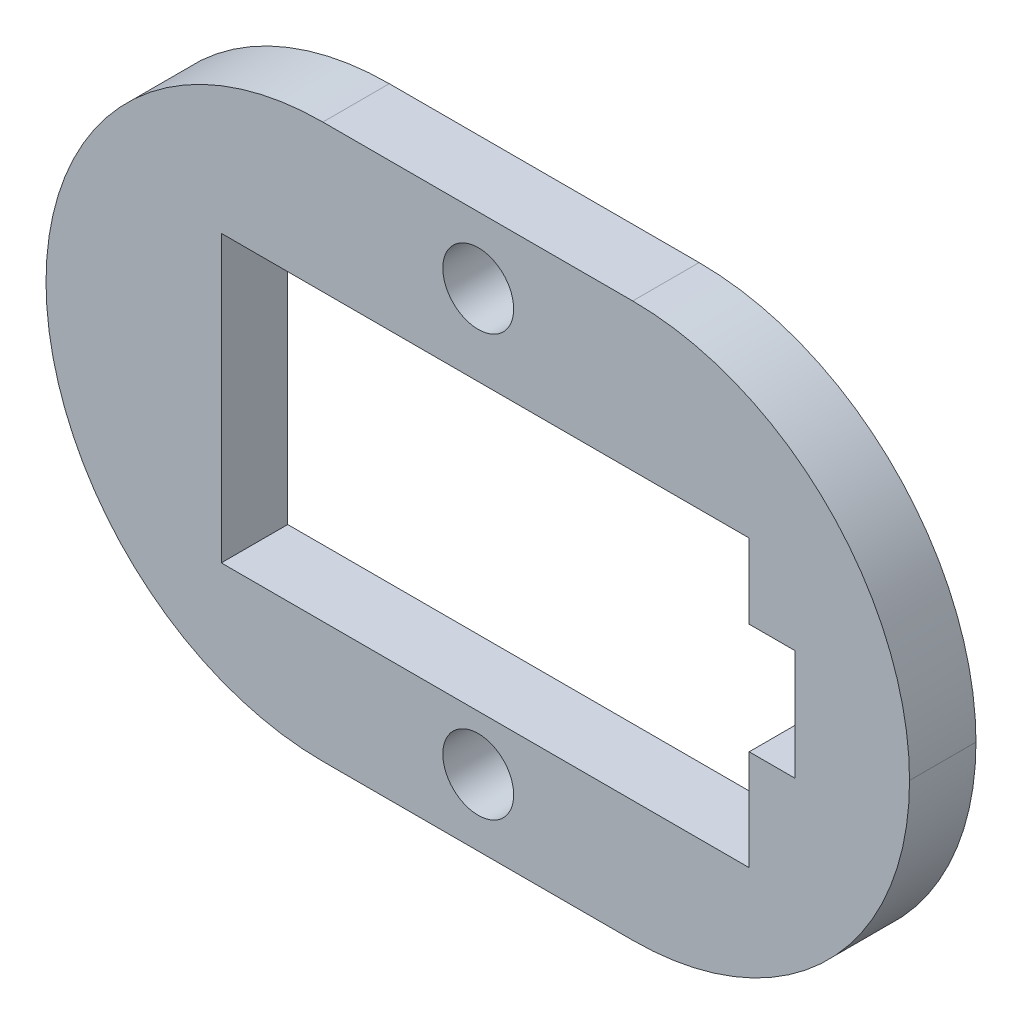
ISO-10303-21;
HEADER;
FILE_DESCRIPTION(('STEP AP214'),'2;1');
FILE_NAME('part.step','',(''),(''),'','','');
FILE_SCHEMA(('AUTOMOTIVE_DESIGN { 1 0 10303 214 1 1 1 1 }'));
ENDSEC;
DATA;
#1=APPLICATION_CONTEXT('core data for automotive mechanical design processes');
#2=APPLICATION_PROTOCOL_DEFINITION('international standard','automotive_design',2000,#1);
#3=PRODUCT_CONTEXT('',#1,'mechanical');
#4=PRODUCT('Part','Part','',(#3));
#5=PRODUCT_RELATED_PRODUCT_CATEGORY('part','',(#4));
#6=PRODUCT_DEFINITION_FORMATION('','',#4);
#7=PRODUCT_DEFINITION_CONTEXT('part definition',#1,'design');
#8=PRODUCT_DEFINITION('design','',#6,#7);
#9=PRODUCT_DEFINITION_SHAPE('','',#8);
#10=(LENGTH_UNIT() NAMED_UNIT(*) SI_UNIT(.MILLI.,.METRE.));
#11=(NAMED_UNIT(*) PLANE_ANGLE_UNIT() SI_UNIT($,.RADIAN.));
#12=(NAMED_UNIT(*) SI_UNIT($,.STERADIAN.) SOLID_ANGLE_UNIT());
#13=UNCERTAINTY_MEASURE_WITH_UNIT(LENGTH_MEASURE(1.E-05),#10,'distance_accuracy_value','');
#14=(GEOMETRIC_REPRESENTATION_CONTEXT(3) GLOBAL_UNCERTAINTY_ASSIGNED_CONTEXT((#13)) GLOBAL_UNIT_ASSIGNED_CONTEXT((#10,
#11,#12)) REPRESENTATION_CONTEXT('',''));
#15=CARTESIAN_POINT('',(0.,0.,0.));
#16=DIRECTION('',(0.,0.,1.));
#17=DIRECTION('',(1.,0.,0.));
#18=AXIS2_PLACEMENT_3D('',#15,#16,#17);
#19=CARTESIAN_POINT('',(-8.50332149258777,12.5,3.));
#20=DIRECTION('',(0.,0.,-1.));
#21=DIRECTION('',(-1.,0.,0.));
#22=AXIS2_PLACEMENT_3D('',#19,#20,#21);
#23=CYLINDRICAL_SURFACE('',#22,12.5);
#24=CARTESIAN_POINT('',(-8.50332149258777,12.5,0.));
#25=DIRECTION('',(0.,0.,-1.));
#26=DIRECTION('',(-1.,0.,0.));
#27=AXIS2_PLACEMENT_3D('',#24,#25,#26);
#28=CIRCLE('',#27,12.5);
#29=CARTESIAN_POINT('',(-8.50332149258777,0.,0.));
#30=VERTEX_POINT('',#29);
#31=CARTESIAN_POINT('',(-21.0033214925878,12.5,0.));
#32=VERTEX_POINT('',#31);
#33=EDGE_CURVE('E210',#30,#32,#28,.T.);
#34=ORIENTED_EDGE('',*,*,#33,.F.);
#35=DIRECTION('',(0.,0.,-1.));
#36=VECTOR('',#35,1.);
#37=CARTESIAN_POINT('',(-8.50332149258777,0.,3.));
#38=LINE('',#37,#36);
#39=CARTESIAN_POINT('',(-8.50332149258777,0.,3.));
#40=VERTEX_POINT('',#39);
#41=EDGE_CURVE('E264',#40,#30,#38,.T.);
#42=ORIENTED_EDGE('',*,*,#41,.F.);
#43=CARTESIAN_POINT('',(-8.50332149258777,12.5,3.));
#44=DIRECTION('',(0.,0.,-1.));
#45=DIRECTION('',(-1.,0.,0.));
#46=AXIS2_PLACEMENT_3D('',#43,#44,#45);
#47=CIRCLE('',#46,12.5);
#48=CARTESIAN_POINT('',(-21.0033214925878,12.5,3.));
#49=VERTEX_POINT('',#48);
#50=EDGE_CURVE('E222',#40,#49,#47,.T.);
#51=ORIENTED_EDGE('',*,*,#50,.T.);
#52=DIRECTION('',(0.,0.,-1.));
#53=VECTOR('',#52,1.);
#54=CARTESIAN_POINT('',(-21.0033214925878,12.5,3.));
#55=LINE('',#54,#53);
#56=EDGE_CURVE('E244',#49,#32,#55,.T.);
#57=ORIENTED_EDGE('',*,*,#56,.T.);
#58=EDGE_LOOP('',(#34,#42,#51,#57));
#59=FACE_BOUND('',#58,.T.);
#60=ADVANCED_FACE('F41',(#59),#23,.T.);
#61=CARTESIAN_POINT('',(5.48658919269266,0.,3.));
#62=DIRECTION('',(0.,-1.,0.));
#63=DIRECTION('',(0.,0.,-1.));
#64=AXIS2_PLACEMENT_3D('',#61,#62,#63);
#65=PLANE('',#64);
#66=DIRECTION('',(-1.,0.,0.));
#67=VECTOR('',#66,1.);
#68=CARTESIAN_POINT('',(5.48658919269266,0.,0.));
#69=LINE('',#68,#67);
#70=CARTESIAN_POINT('',(5.48658919269266,0.,0.));
#71=VERTEX_POINT('',#70);
#72=EDGE_CURVE('E226',#71,#30,#69,.T.);
#73=ORIENTED_EDGE('',*,*,#72,.F.);
#74=DIRECTION('',(0.,0.,-1.));
#75=VECTOR('',#74,1.);
#76=CARTESIAN_POINT('',(5.48658919269266,0.,3.));
#77=LINE('',#76,#75);
#78=CARTESIAN_POINT('',(5.48658919269266,0.,3.));
#79=VERTEX_POINT('',#78);
#80=EDGE_CURVE('E267',#79,#71,#77,.T.);
#81=ORIENTED_EDGE('',*,*,#80,.F.);
#82=DIRECTION('',(-1.,0.,0.));
#83=VECTOR('',#82,1.);
#84=CARTESIAN_POINT('',(5.48658919269266,0.,3.));
#85=LINE('',#84,#83);
#86=EDGE_CURVE('E241',#79,#40,#85,.T.);
#87=ORIENTED_EDGE('',*,*,#86,.T.);
#88=ORIENTED_EDGE('',*,*,#41,.T.);
#89=EDGE_LOOP('',(#73,#81,#87,#88));
#90=FACE_BOUND('',#89,.T.);
#91=ADVANCED_FACE('F327',(#90),#65,.T.);
#92=CARTESIAN_POINT('',(5.48658919269266,12.5,3.));
#93=DIRECTION('',(0.,0.,-1.));
#94=DIRECTION('',(-1.,0.,0.));
#95=AXIS2_PLACEMENT_3D('',#92,#93,#94);
#96=CYLINDRICAL_SURFACE('',#95,12.5);
#97=CARTESIAN_POINT('',(5.48658919269266,12.5,0.));
#98=DIRECTION('',(0.,0.,-1.));
#99=DIRECTION('',(-1.,0.,0.));
#100=AXIS2_PLACEMENT_3D('',#97,#98,#99);
#101=CIRCLE('',#100,12.5);
#102=CARTESIAN_POINT('',(17.9865891926927,12.5,0.));
#103=VERTEX_POINT('',#102);
#104=EDGE_CURVE('E259',#103,#71,#101,.T.);
#105=ORIENTED_EDGE('',*,*,#104,.F.);
#106=DIRECTION('',(0.,0.,-1.));
#107=VECTOR('',#106,1.);
#108=CARTESIAN_POINT('',(17.9865891926927,12.5,3.));
#109=LINE('',#108,#107);
#110=CARTESIAN_POINT('',(17.9865891926927,12.5,3.));
#111=VERTEX_POINT('',#110);
#112=EDGE_CURVE('E269',#111,#103,#109,.T.);
#113=ORIENTED_EDGE('',*,*,#112,.F.);
#114=CARTESIAN_POINT('',(5.48658919269266,12.5,3.));
#115=DIRECTION('',(0.,0.,-1.));
#116=DIRECTION('',(-1.,0.,0.));
#117=AXIS2_PLACEMENT_3D('',#114,#115,#116);
#118=CIRCLE('',#117,12.5);
#119=EDGE_CURVE('E238',#111,#79,#118,.T.);
#120=ORIENTED_EDGE('',*,*,#119,.T.);
#121=ORIENTED_EDGE('',*,*,#80,.T.);
#122=EDGE_LOOP('',(#105,#113,#120,#121));
#123=FACE_BOUND('',#122,.T.);
#124=ADVANCED_FACE('F325',(#123),#96,.T.);
#125=CARTESIAN_POINT('',(17.9865891926927,12.501,3.));
#126=DIRECTION('',(1.,0.,0.));
#127=DIRECTION('',(0.,0.,-1.));
#128=AXIS2_PLACEMENT_3D('',#125,#126,#127);
#129=PLANE('',#128);
#130=DIRECTION('',(0.,-1.,0.));
#131=VECTOR('',#130,1.);
#132=CARTESIAN_POINT('',(17.9865891926927,12.501,0.));
#133=LINE('',#132,#131);
#134=CARTESIAN_POINT('',(17.9865891926927,12.501,0.));
#135=VERTEX_POINT('',#134);
#136=EDGE_CURVE('E256',#135,#103,#133,.T.);
#137=ORIENTED_EDGE('',*,*,#136,.F.);
#138=DIRECTION('',(0.,0.,-1.));
#139=VECTOR('',#138,1.);
#140=CARTESIAN_POINT('',(17.9865891926927,12.501,3.));
#141=LINE('',#140,#139);
#142=CARTESIAN_POINT('',(17.9865891926927,12.501,3.));
#143=VERTEX_POINT('',#142);
#144=EDGE_CURVE('E271',#143,#135,#141,.T.);
#145=ORIENTED_EDGE('',*,*,#144,.F.);
#146=DIRECTION('',(0.,-1.,0.));
#147=VECTOR('',#146,1.);
#148=CARTESIAN_POINT('',(17.9865891926927,12.501,3.));
#149=LINE('',#148,#147);
#150=EDGE_CURVE('E235',#143,#111,#149,.T.);
#151=ORIENTED_EDGE('',*,*,#150,.T.);
#152=ORIENTED_EDGE('',*,*,#112,.T.);
#153=EDGE_LOOP('',(#137,#145,#151,#152));
#154=FACE_BOUND('',#153,.T.);
#155=ADVANCED_FACE('F321',(#154),#129,.T.);
#156=CARTESIAN_POINT('',(5.48658919269266,12.501,3.));
#157=DIRECTION('',(0.,0.,-1.));
#158=DIRECTION('',(-1.,0.,0.));
#159=AXIS2_PLACEMENT_3D('',#156,#157,#158);
#160=CYLINDRICAL_SURFACE('',#159,12.5);
#161=CARTESIAN_POINT('',(5.48658919269266,12.501,0.));
#162=DIRECTION('',(0.,0.,-1.));
#163=DIRECTION('',(-1.,0.,0.));
#164=AXIS2_PLACEMENT_3D('',#161,#162,#163);
#165=CIRCLE('',#164,12.5);
#166=CARTESIAN_POINT('',(5.48658919269266,25.001,0.));
#167=VERTEX_POINT('',#166);
#168=EDGE_CURVE('E253',#167,#135,#165,.T.);
#169=ORIENTED_EDGE('',*,*,#168,.F.);
#170=DIRECTION('',(0.,0.,-1.));
#171=VECTOR('',#170,1.);
#172=CARTESIAN_POINT('',(5.48658919269266,25.001,3.));
#173=LINE('',#172,#171);
#174=CARTESIAN_POINT('',(5.48658919269266,25.001,3.));
#175=VERTEX_POINT('',#174);
#176=EDGE_CURVE('E273',#175,#167,#173,.T.);
#177=ORIENTED_EDGE('',*,*,#176,.F.);
#178=CARTESIAN_POINT('',(5.48658919269266,12.501,3.));
#179=DIRECTION('',(0.,0.,-1.));
#180=DIRECTION('',(-1.,0.,0.));
#181=AXIS2_PLACEMENT_3D('',#178,#179,#180);
#182=CIRCLE('',#181,12.5);
#183=EDGE_CURVE('E232',#175,#143,#182,.T.);
#184=ORIENTED_EDGE('',*,*,#183,.T.);
#185=ORIENTED_EDGE('',*,*,#144,.T.);
#186=EDGE_LOOP('',(#169,#177,#184,#185));
#187=FACE_BOUND('',#186,.T.);
#188=ADVANCED_FACE('F317',(#187),#160,.T.);
#189=CARTESIAN_POINT('',(-8.50332151258617,25.001,3.));
#190=DIRECTION('',(0.,1.,0.));
#191=DIRECTION('',(-1.,0.,0.));
#192=AXIS2_PLACEMENT_3D('',#189,#190,#191);
#193=PLANE('',#192);
#194=DIRECTION('',(1.,0.,0.));
#195=VECTOR('',#194,1.);
#196=CARTESIAN_POINT('',(-8.50332151258617,25.001,0.));
#197=LINE('',#196,#195);
#198=CARTESIAN_POINT('',(-8.50332151258617,25.001,0.));
#199=VERTEX_POINT('',#198);
#200=EDGE_CURVE('E250',#199,#167,#197,.T.);
#201=ORIENTED_EDGE('',*,*,#200,.F.);
#202=DIRECTION('',(0.,0.,-1.));
#203=VECTOR('',#202,1.);
#204=CARTESIAN_POINT('',(-8.50332151258617,25.001,3.));
#205=LINE('',#204,#203);
#206=CARTESIAN_POINT('',(-8.50332151258617,25.001,3.));
#207=VERTEX_POINT('',#206);
#208=EDGE_CURVE('E275',#207,#199,#205,.T.);
#209=ORIENTED_EDGE('',*,*,#208,.F.);
#210=DIRECTION('',(1.,0.,0.));
#211=VECTOR('',#210,1.);
#212=CARTESIAN_POINT('',(-8.50332151258617,25.001,3.));
#213=LINE('',#212,#211);
#214=EDGE_CURVE('E229',#207,#175,#213,.T.);
#215=ORIENTED_EDGE('',*,*,#214,.T.);
#216=ORIENTED_EDGE('',*,*,#176,.T.);
#217=EDGE_LOOP('',(#201,#209,#215,#216));
#218=FACE_BOUND('',#217,.T.);
#219=ADVANCED_FACE('F313',(#218),#193,.T.);
#220=CARTESIAN_POINT('',(-8.50332151258617,12.50099998,3.));
#221=DIRECTION('',(0.,0.,-1.));
#222=DIRECTION('',(-1.,0.,0.));
#223=AXIS2_PLACEMENT_3D('',#220,#221,#222);
#224=CYLINDRICAL_SURFACE('',#223,12.50000002);
#225=CARTESIAN_POINT('',(-8.50332151258617,12.50099998,0.));
#226=DIRECTION('',(0.,0.,-1.));
#227=DIRECTION('',(-1.,0.,0.));
#228=AXIS2_PLACEMENT_3D('',#225,#226,#227);
#229=CIRCLE('',#228,12.50000002);
#230=EDGE_CURVE('E247',#32,#199,#229,.T.);
#231=ORIENTED_EDGE('',*,*,#230,.F.);
#232=ORIENTED_EDGE('',*,*,#56,.F.);
#233=CARTESIAN_POINT('',(-8.50332151258617,12.50099998,3.));
#234=DIRECTION('',(0.,0.,-1.));
#235=DIRECTION('',(-1.,0.,0.));
#236=AXIS2_PLACEMENT_3D('',#233,#234,#235);
#237=CIRCLE('',#236,12.50000002);
#238=EDGE_CURVE('E225',#49,#207,#237,.T.);
#239=ORIENTED_EDGE('',*,*,#238,.T.);
#240=ORIENTED_EDGE('',*,*,#208,.T.);
#241=EDGE_LOOP('',(#231,#232,#239,#240));
#242=FACE_BOUND('',#241,.T.);
#243=ADVANCED_FACE('F309',(#242),#224,.T.);
#244=CARTESIAN_POINT('',(-8.50332149258777,12.5,3.));
#245=DIRECTION('',(0.,0.,-1.));
#246=DIRECTION('',(-1.,0.,0.));
#247=AXIS2_PLACEMENT_3D('',#244,#245,#246);
#248=PLANE('',#247);
#249=CARTESIAN_POINT('',(-1.48790597129112,21.9995,3.));
#250=DIRECTION('',(0.,0.,1.));
#251=DIRECTION('',(1.,0.,0.));
#252=AXIS2_PLACEMENT_3D('',#249,#250,#251);
#253=CIRCLE('',#252,1.6);
#254=CARTESIAN_POINT('',(0.11209402870888,21.9995,3.));
#255=VERTEX_POINT('',#254);
#256=EDGE_CURVE('E192',#255,#255,#253,.T.);
#257=ORIENTED_EDGE('',*,*,#256,.F.);
#258=EDGE_LOOP('',(#257));
#259=FACE_BOUND('',#258,.T.);
#260=CARTESIAN_POINT('',(-1.48790597129112,2.9995,3.));
#261=DIRECTION('',(0.,0.,1.));
#262=DIRECTION('',(1.,0.,0.));
#263=AXIS2_PLACEMENT_3D('',#260,#261,#262);
#264=CIRCLE('',#263,1.6);
#265=CARTESIAN_POINT('',(0.11209402870888,2.9995,3.));
#266=VERTEX_POINT('',#265);
#267=EDGE_CURVE('E174',#266,#266,#264,.T.);
#268=ORIENTED_EDGE('',*,*,#267,.F.);
#269=EDGE_LOOP('',(#268));
#270=FACE_BOUND('',#269,.T.);
#271=DIRECTION('',(1.,0.,0.));
#272=VECTOR('',#271,1.);
#273=CARTESIAN_POINT('',(12.8054141089037,14.9896847646827,3.));
#274=LINE('',#273,#272);
#275=CARTESIAN_POINT('',(10.7445904090118,14.9896847646827,3.));
#276=VERTEX_POINT('',#275);
#277=CARTESIAN_POINT('',(12.8054141089037,14.9896847646827,3.));
#278=VERTEX_POINT('',#277);
#279=EDGE_CURVE('E157',#276,#278,#274,.T.);
#280=ORIENTED_EDGE('',*,*,#279,.T.);
#281=DIRECTION('',(0.,-1.,0.));
#282=VECTOR('',#281,1.);
#283=CARTESIAN_POINT('',(12.8054141089037,10.001,3.));
#284=LINE('',#283,#282);
#285=CARTESIAN_POINT('',(12.8054141089037,10.001,3.));
#286=VERTEX_POINT('',#285);
#287=EDGE_CURVE('E151',#278,#286,#284,.T.);
#288=ORIENTED_EDGE('',*,*,#287,.T.);
#289=DIRECTION('',(-1.,0.,0.));
#290=VECTOR('',#289,1.);
#291=CARTESIAN_POINT('',(10.7445904090118,10.001,3.));
#292=LINE('',#291,#290);
#293=CARTESIAN_POINT('',(10.7445904090118,10.001,3.));
#294=VERTEX_POINT('',#293);
#295=EDGE_CURVE('E160',#286,#294,#292,.T.);
#296=ORIENTED_EDGE('',*,*,#295,.T.);
#297=DIRECTION('',(0.,-1.,0.));
#298=VECTOR('',#297,1.);
#299=CARTESIAN_POINT('',(10.7445904090118,5.47023212857004,3.));
#300=LINE('',#299,#298);
#301=CARTESIAN_POINT('',(10.7445904090118,5.47023212857004,3.));
#302=VERTEX_POINT('',#301);
#303=EDGE_CURVE('E57',#294,#302,#300,.T.);
#304=ORIENTED_EDGE('',*,*,#303,.T.);
#305=DIRECTION('',(-1.,0.,0.));
#306=VECTOR('',#305,1.);
#307=CARTESIAN_POINT('',(-13.0892489359398,5.47023212857004,3.));
#308=LINE('',#307,#306);
#309=CARTESIAN_POINT('',(-13.0892489359398,5.47023212857004,3.));
#310=VERTEX_POINT('',#309);
#311=EDGE_CURVE('E178',#302,#310,#308,.T.);
#312=ORIENTED_EDGE('',*,*,#311,.T.);
#313=DIRECTION('',(0.,1.,0.));
#314=VECTOR('',#313,1.);
#315=CARTESIAN_POINT('',(-13.0892489359398,18.3586192682343,3.));
#316=LINE('',#315,#314);
#317=CARTESIAN_POINT('',(-13.0892489359398,18.3586192682343,3.));
#318=VERTEX_POINT('',#317);
#319=EDGE_CURVE('E181',#310,#318,#316,.T.);
#320=ORIENTED_EDGE('',*,*,#319,.T.);
#321=DIRECTION('',(1.,0.,0.));
#322=VECTOR('',#321,1.);
#323=CARTESIAN_POINT('',(10.7445904090118,18.3586192682343,3.));
#324=LINE('',#323,#322);
#325=CARTESIAN_POINT('',(10.7445904090118,18.3586192682343,3.));
#326=VERTEX_POINT('',#325);
#327=EDGE_CURVE('E184',#318,#326,#324,.T.);
#328=ORIENTED_EDGE('',*,*,#327,.T.);
#329=DIRECTION('',(0.,-1.,0.));
#330=VECTOR('',#329,1.);
#331=CARTESIAN_POINT('',(10.7445904090118,14.9896847646827,3.));
#332=LINE('',#331,#330);
#333=EDGE_CURVE('E187',#326,#276,#332,.T.);
#334=ORIENTED_EDGE('',*,*,#333,.T.);
#335=EDGE_LOOP('',(#280,#288,#296,#304,#312,#320,#328,#334));
#336=FACE_BOUND('',#335,.T.);
#337=ORIENTED_EDGE('',*,*,#50,.F.);
#338=ORIENTED_EDGE('',*,*,#86,.F.);
#339=ORIENTED_EDGE('',*,*,#119,.F.);
#340=ORIENTED_EDGE('',*,*,#150,.F.);
#341=ORIENTED_EDGE('',*,*,#183,.F.);
#342=ORIENTED_EDGE('',*,*,#214,.F.);
#343=ORIENTED_EDGE('',*,*,#238,.F.);
#344=EDGE_LOOP('',(#337,#338,#339,#340,#341,#342,#343));
#345=FACE_BOUND('',#344,.T.);
#346=ADVANCED_FACE('F164',(#259,#270,#336,#345),#248,.F.);
#347=CARTESIAN_POINT('',(-8.50332149258777,12.5,0.));
#348=DIRECTION('',(0.,0.,-1.));
#349=DIRECTION('',(-1.,0.,0.));
#350=AXIS2_PLACEMENT_3D('',#347,#348,#349);
#351=PLANE('',#350);
#352=CARTESIAN_POINT('',(-1.48790597129112,2.9995,0.));
#353=DIRECTION('',(0.,0.,-1.));
#354=DIRECTION('',(-1.,0.,0.));
#355=AXIS2_PLACEMENT_3D('',#352,#353,#354);
#356=CIRCLE('',#355,1.9);
#357=CARTESIAN_POINT('',(-3.38790597129112,2.9995,0.));
#358=VERTEX_POINT('',#357);
#359=EDGE_CURVE('E280',#358,#358,#356,.F.);
#360=ORIENTED_EDGE('',*,*,#359,.T.);
#361=EDGE_LOOP('',(#360));
#362=FACE_BOUND('',#361,.T.);
#363=CARTESIAN_POINT('',(-1.48790597129112,21.9995,0.));
#364=DIRECTION('',(0.,0.,-1.));
#365=DIRECTION('',(-1.,0.,0.));
#366=AXIS2_PLACEMENT_3D('',#363,#364,#365);
#367=CIRCLE('',#366,1.9);
#368=CARTESIAN_POINT('',(-3.38790597129112,21.9995,0.));
#369=VERTEX_POINT('',#368);
#370=EDGE_CURVE('E266',#369,#369,#367,.F.);
#371=ORIENTED_EDGE('',*,*,#370,.T.);
#372=EDGE_LOOP('',(#371));
#373=FACE_BOUND('',#372,.T.);
#374=DIRECTION('',(0.,-1.,0.));
#375=VECTOR('',#374,1.);
#376=CARTESIAN_POINT('',(12.8054141089037,10.001,0.));
#377=LINE('',#376,#375);
#378=CARTESIAN_POINT('',(12.8054141089037,14.9896847646827,0.));
#379=VERTEX_POINT('',#378);
#380=CARTESIAN_POINT('',(12.8054141089037,10.001,0.));
#381=VERTEX_POINT('',#380);
#382=EDGE_CURVE('E65',#379,#381,#377,.T.);
#383=ORIENTED_EDGE('',*,*,#382,.F.);
#384=DIRECTION('',(1.,0.,0.));
#385=VECTOR('',#384,1.);
#386=CARTESIAN_POINT('',(12.8054141089037,14.9896847646827,0.));
#387=LINE('',#386,#385);
#388=CARTESIAN_POINT('',(10.7445904090118,14.9896847646827,0.));
#389=VERTEX_POINT('',#388);
#390=EDGE_CURVE('E168',#389,#379,#387,.T.);
#391=ORIENTED_EDGE('',*,*,#390,.F.);
#392=DIRECTION('',(0.,-1.,0.));
#393=VECTOR('',#392,1.);
#394=CARTESIAN_POINT('',(10.7445904090118,14.9896847646827,0.));
#395=LINE('',#394,#393);
#396=CARTESIAN_POINT('',(10.7445904090118,18.3586192682343,0.));
#397=VERTEX_POINT('',#396);
#398=EDGE_CURVE('E171',#397,#389,#395,.T.);
#399=ORIENTED_EDGE('',*,*,#398,.F.);
#400=DIRECTION('',(1.,0.,0.));
#401=VECTOR('',#400,1.);
#402=CARTESIAN_POINT('',(10.7445904090118,18.3586192682343,0.));
#403=LINE('',#402,#401);
#404=CARTESIAN_POINT('',(-13.0892489359398,18.3586192682343,0.));
#405=VERTEX_POINT('',#404);
#406=EDGE_CURVE('E203',#405,#397,#403,.T.);
#407=ORIENTED_EDGE('',*,*,#406,.F.);
#408=DIRECTION('',(0.,1.,0.));
#409=VECTOR('',#408,1.);
#410=CARTESIAN_POINT('',(-13.0892489359398,18.3586192682343,0.));
#411=LINE('',#410,#409);
#412=CARTESIAN_POINT('',(-13.0892489359398,5.47023212857004,0.));
#413=VERTEX_POINT('',#412);
#414=EDGE_CURVE('E200',#413,#405,#411,.T.);
#415=ORIENTED_EDGE('',*,*,#414,.F.);
#416=DIRECTION('',(-1.,0.,0.));
#417=VECTOR('',#416,1.);
#418=CARTESIAN_POINT('',(-13.0892489359398,5.47023212857004,0.));
#419=LINE('',#418,#417);
#420=CARTESIAN_POINT('',(10.7445904090118,5.47023212857004,0.));
#421=VERTEX_POINT('',#420);
#422=EDGE_CURVE('E197',#421,#413,#419,.T.);
#423=ORIENTED_EDGE('',*,*,#422,.F.);
#424=DIRECTION('',(0.,-1.,0.));
#425=VECTOR('',#424,1.);
#426=CARTESIAN_POINT('',(10.7445904090118,5.47023212857004,0.));
#427=LINE('',#426,#425);
#428=CARTESIAN_POINT('',(10.7445904090118,10.001,0.));
#429=VERTEX_POINT('',#428);
#430=EDGE_CURVE('E194',#429,#421,#427,.T.);
#431=ORIENTED_EDGE('',*,*,#430,.F.);
#432=DIRECTION('',(-1.,0.,0.));
#433=VECTOR('',#432,1.);
#434=CARTESIAN_POINT('',(10.7445904090118,10.001,0.));
#435=LINE('',#434,#433);
#436=EDGE_CURVE('E191',#381,#429,#435,.T.);
#437=ORIENTED_EDGE('',*,*,#436,.F.);
#438=EDGE_LOOP('',(#383,#391,#399,#407,#415,#423,#431,#437));
#439=FACE_BOUND('',#438,.T.);
#440=ORIENTED_EDGE('',*,*,#33,.T.);
#441=ORIENTED_EDGE('',*,*,#230,.T.);
#442=ORIENTED_EDGE('',*,*,#200,.T.);
#443=ORIENTED_EDGE('',*,*,#168,.T.);
#444=ORIENTED_EDGE('',*,*,#136,.T.);
#445=ORIENTED_EDGE('',*,*,#104,.T.);
#446=ORIENTED_EDGE('',*,*,#72,.T.);
#447=EDGE_LOOP('',(#440,#441,#442,#443,#444,#445,#446));
#448=FACE_BOUND('',#447,.T.);
#449=ADVANCED_FACE('F294',(#362,#373,#439,#448),#351,.T.);
#450=CARTESIAN_POINT('',(12.8054141089037,10.001,3.));
#451=DIRECTION('',(1.,0.,0.));
#452=DIRECTION('',(0.,0.,-1.));
#453=AXIS2_PLACEMENT_3D('',#450,#451,#452);
#454=PLANE('',#453);
#455=ORIENTED_EDGE('',*,*,#382,.T.);
#456=DIRECTION('',(0.,0.,-1.));
#457=VECTOR('',#456,1.);
#458=CARTESIAN_POINT('',(12.8054141089037,10.001,3.));
#459=LINE('',#458,#457);
#460=EDGE_CURVE('E147',#286,#381,#459,.T.);
#461=ORIENTED_EDGE('',*,*,#460,.F.);
#462=ORIENTED_EDGE('',*,*,#287,.F.);
#463=DIRECTION('',(0.,0.,-1.));
#464=VECTOR('',#463,1.);
#465=CARTESIAN_POINT('',(12.8054141089037,14.9896847646827,3.));
#466=LINE('',#465,#464);
#467=EDGE_CURVE('E208',#278,#379,#466,.T.);
#468=ORIENTED_EDGE('',*,*,#467,.T.);
#469=EDGE_LOOP('',(#455,#461,#462,#468));
#470=FACE_BOUND('',#469,.T.);
#471=ADVANCED_FACE('F149',(#470),#454,.F.);
#472=CARTESIAN_POINT('',(12.8054141089037,14.9896847646827,3.));
#473=DIRECTION('',(0.,1.,0.));
#474=DIRECTION('',(0.,0.,1.));
#475=AXIS2_PLACEMENT_3D('',#472,#473,#474);
#476=PLANE('',#475);
#477=ORIENTED_EDGE('',*,*,#390,.T.);
#478=ORIENTED_EDGE('',*,*,#467,.F.);
#479=ORIENTED_EDGE('',*,*,#279,.F.);
#480=DIRECTION('',(0.,0.,-1.));
#481=VECTOR('',#480,1.);
#482=CARTESIAN_POINT('',(10.7445904090118,14.9896847646827,3.));
#483=LINE('',#482,#481);
#484=EDGE_CURVE('E211',#276,#389,#483,.T.);
#485=ORIENTED_EDGE('',*,*,#484,.T.);
#486=EDGE_LOOP('',(#477,#478,#479,#485));
#487=FACE_BOUND('',#486,.T.);
#488=ADVANCED_FACE('F390',(#487),#476,.F.);
#489=CARTESIAN_POINT('',(10.7445904090118,14.9896847646827,3.));
#490=DIRECTION('',(1.,0.,0.));
#491=DIRECTION('',(0.,0.,-1.));
#492=AXIS2_PLACEMENT_3D('',#489,#490,#491);
#493=PLANE('',#492);
#494=ORIENTED_EDGE('',*,*,#398,.T.);
#495=ORIENTED_EDGE('',*,*,#484,.F.);
#496=ORIENTED_EDGE('',*,*,#333,.F.);
#497=DIRECTION('',(0.,0.,-1.));
#498=VECTOR('',#497,1.);
#499=CARTESIAN_POINT('',(10.7445904090118,18.3586192682343,3.));
#500=LINE('',#499,#498);
#501=EDGE_CURVE('E213',#326,#397,#500,.T.);
#502=ORIENTED_EDGE('',*,*,#501,.T.);
#503=EDGE_LOOP('',(#494,#495,#496,#502));
#504=FACE_BOUND('',#503,.T.);
#505=ADVANCED_FACE('F398',(#504),#493,.F.);
#506=CARTESIAN_POINT('',(10.7445904090118,18.3586192682343,3.));
#507=DIRECTION('',(0.,1.,0.));
#508=DIRECTION('',(0.,0.,1.));
#509=AXIS2_PLACEMENT_3D('',#506,#507,#508);
#510=PLANE('',#509);
#511=ORIENTED_EDGE('',*,*,#406,.T.);
#512=ORIENTED_EDGE('',*,*,#501,.F.);
#513=ORIENTED_EDGE('',*,*,#327,.F.);
#514=DIRECTION('',(0.,0.,-1.));
#515=VECTOR('',#514,1.);
#516=CARTESIAN_POINT('',(-13.0892489359398,18.3586192682343,3.));
#517=LINE('',#516,#515);
#518=EDGE_CURVE('E215',#318,#405,#517,.T.);
#519=ORIENTED_EDGE('',*,*,#518,.T.);
#520=EDGE_LOOP('',(#511,#512,#513,#519));
#521=FACE_BOUND('',#520,.T.);
#522=ADVANCED_FACE('F407',(#521),#510,.F.);
#523=CARTESIAN_POINT('',(-13.0892489359398,18.3586192682343,3.));
#524=DIRECTION('',(-1.,0.,0.));
#525=DIRECTION('',(0.,-1.,0.));
#526=AXIS2_PLACEMENT_3D('',#523,#524,#525);
#527=PLANE('',#526);
#528=ORIENTED_EDGE('',*,*,#414,.T.);
#529=ORIENTED_EDGE('',*,*,#518,.F.);
#530=ORIENTED_EDGE('',*,*,#319,.F.);
#531=DIRECTION('',(0.,0.,-1.));
#532=VECTOR('',#531,1.);
#533=CARTESIAN_POINT('',(-13.0892489359398,5.47023212857004,3.));
#534=LINE('',#533,#532);
#535=EDGE_CURVE('E217',#310,#413,#534,.T.);
#536=ORIENTED_EDGE('',*,*,#535,.T.);
#537=EDGE_LOOP('',(#528,#529,#530,#536));
#538=FACE_BOUND('',#537,.T.);
#539=ADVANCED_FACE('F416',(#538),#527,.F.);
#540=CARTESIAN_POINT('',(-13.0892489359398,5.47023212857004,3.));
#541=DIRECTION('',(0.,-1.,0.));
#542=DIRECTION('',(1.,0.,0.));
#543=AXIS2_PLACEMENT_3D('',#540,#541,#542);
#544=PLANE('',#543);
#545=ORIENTED_EDGE('',*,*,#422,.T.);
#546=ORIENTED_EDGE('',*,*,#535,.F.);
#547=ORIENTED_EDGE('',*,*,#311,.F.);
#548=DIRECTION('',(0.,0.,-1.));
#549=VECTOR('',#548,1.);
#550=CARTESIAN_POINT('',(10.7445904090118,5.47023212857004,3.));
#551=LINE('',#550,#549);
#552=EDGE_CURVE('E219',#302,#421,#551,.T.);
#553=ORIENTED_EDGE('',*,*,#552,.T.);
#554=EDGE_LOOP('',(#545,#546,#547,#553));
#555=FACE_BOUND('',#554,.T.);
#556=ADVANCED_FACE('F425',(#555),#544,.F.);
#557=CARTESIAN_POINT('',(10.7445904090118,5.47023212857004,3.));
#558=DIRECTION('',(1.,0.,0.));
#559=DIRECTION('',(0.,0.,-1.));
#560=AXIS2_PLACEMENT_3D('',#557,#558,#559);
#561=PLANE('',#560);
#562=ORIENTED_EDGE('',*,*,#430,.T.);
#563=ORIENTED_EDGE('',*,*,#552,.F.);
#564=ORIENTED_EDGE('',*,*,#303,.F.);
#565=DIRECTION('',(0.,0.,-1.));
#566=VECTOR('',#565,1.);
#567=CARTESIAN_POINT('',(10.7445904090118,10.001,3.));
#568=LINE('',#567,#566);
#569=EDGE_CURVE('E156',#294,#429,#568,.T.);
#570=ORIENTED_EDGE('',*,*,#569,.T.);
#571=EDGE_LOOP('',(#562,#563,#564,#570));
#572=FACE_BOUND('',#571,.T.);
#573=ADVANCED_FACE('F434',(#572),#561,.F.);
#574=CARTESIAN_POINT('',(10.7445904090118,10.001,3.));
#575=DIRECTION('',(0.,-1.,0.));
#576=DIRECTION('',(0.,0.,-1.));
#577=AXIS2_PLACEMENT_3D('',#574,#575,#576);
#578=PLANE('',#577);
#579=ORIENTED_EDGE('',*,*,#436,.T.);
#580=ORIENTED_EDGE('',*,*,#569,.F.);
#581=ORIENTED_EDGE('',*,*,#295,.F.);
#582=ORIENTED_EDGE('',*,*,#460,.T.);
#583=EDGE_LOOP('',(#579,#580,#581,#582));
#584=FACE_BOUND('',#583,.T.);
#585=ADVANCED_FACE('F161',(#584),#578,.F.);
#586=CARTESIAN_POINT('',(-1.48790597129112,2.9995,0.));
#587=DIRECTION('',(0.,0.,1.));
#588=DIRECTION('',(1.,0.,0.));
#589=AXIS2_PLACEMENT_3D('',#586,#587,#588);
#590=CYLINDRICAL_SURFACE('',#589,1.6);
#591=CARTESIAN_POINT('',(-1.48790597129112,2.9995,0.299999999999999));
#592=DIRECTION('',(0.,0.,-1.));
#593=DIRECTION('',(-1.,0.,0.));
#594=AXIS2_PLACEMENT_3D('',#591,#592,#593);
#595=CIRCLE('',#594,1.6);
#596=CARTESIAN_POINT('',(-3.08790597129112,2.9995,0.299999999999999));
#597=VERTEX_POINT('',#596);
#598=EDGE_CURVE('E50',#597,#597,#595,.T.);
#599=ORIENTED_EDGE('',*,*,#598,.T.);
#600=EDGE_LOOP('',(#599));
#601=FACE_BOUND('',#600,.T.);
#602=ORIENTED_EDGE('',*,*,#267,.T.);
#603=EDGE_LOOP('',(#602));
#604=FACE_BOUND('',#603,.T.);
#605=ADVANCED_FACE('F285',(#601,#604),#590,.F.);
#606=CARTESIAN_POINT('',(-1.48790597129112,21.9995,0.));
#607=DIRECTION('',(0.,0.,1.));
#608=DIRECTION('',(1.,0.,0.));
#609=AXIS2_PLACEMENT_3D('',#606,#607,#608);
#610=CYLINDRICAL_SURFACE('',#609,1.6);
#611=CARTESIAN_POINT('',(-1.48790597129112,21.9995,0.299999999999998));
#612=DIRECTION('',(0.,0.,-1.));
#613=DIRECTION('',(-1.,0.,0.));
#614=AXIS2_PLACEMENT_3D('',#611,#612,#613);
#615=CIRCLE('',#614,1.6);
#616=CARTESIAN_POINT('',(-3.08790597129112,21.9995,0.299999999999998));
#617=VERTEX_POINT('',#616);
#618=EDGE_CURVE('E11',#617,#617,#615,.T.);
#619=ORIENTED_EDGE('',*,*,#618,.T.);
#620=EDGE_LOOP('',(#619));
#621=FACE_BOUND('',#620,.T.);
#622=ORIENTED_EDGE('',*,*,#256,.T.);
#623=EDGE_LOOP('',(#622));
#624=FACE_BOUND('',#623,.T.);
#625=ADVANCED_FACE('F291',(#621,#624),#610,.F.);
#626=CARTESIAN_POINT('',(-1.48790597129112,2.9995,0.));
#627=DIRECTION('',(0.,0.,-1.));
#628=DIRECTION('',(-1.,0.,0.));
#629=AXIS2_PLACEMENT_3D('',#626,#627,#628);
#630=CONICAL_SURFACE('',#629,1.9,0.785398163397443);
#631=CARTESIAN_POINT('',(-3.08790597129112,2.9995,0.299999999999999));
#632=CARTESIAN_POINT('',(-3.09103097129112,2.9995,0.296874999999999));
#633=CARTESIAN_POINT('',(-3.09415597129112,2.9995,0.293749999999999));
#634=CARTESIAN_POINT('',(-3.10040597129112,2.9995,0.287499999999999));
#635=CARTESIAN_POINT('',(-3.10353097129112,2.9995,0.284374999999999));
#636=CARTESIAN_POINT('',(-3.10978097129112,2.9995,0.278124999999999));
#637=CARTESIAN_POINT('',(-3.11290597129112,2.9995,0.274999999999999));
#638=CARTESIAN_POINT('',(-3.11915597129112,2.9995,0.268749999999999));
#639=CARTESIAN_POINT('',(-3.12228097129112,2.9995,0.265624999999999));
#640=CARTESIAN_POINT('',(-3.12853097129112,2.9995,0.259374999999999));
#641=CARTESIAN_POINT('',(-3.13165597129112,2.9995,0.256249999999999));
#642=CARTESIAN_POINT('',(-3.13790597129112,2.9995,0.249999999999999));
#643=CARTESIAN_POINT('',(-3.14103097129112,2.9995,0.246874999999999));
#644=CARTESIAN_POINT('',(-3.14728097129112,2.9995,0.240624999999999));
#645=CARTESIAN_POINT('',(-3.15040597129112,2.9995,0.237499999999999));
#646=CARTESIAN_POINT('',(-3.15665597129112,2.9995,0.231249999999999));
#647=CARTESIAN_POINT('',(-3.15978097129112,2.9995,0.228124999999999));
#648=CARTESIAN_POINT('',(-3.16603097129112,2.9995,0.221874999999999));
#649=CARTESIAN_POINT('',(-3.16915597129112,2.9995,0.218749999999999));
#650=CARTESIAN_POINT('',(-3.17540597129112,2.9995,0.212499999999999));
#651=CARTESIAN_POINT('',(-3.17853097129112,2.9995,0.209374999999999));
#652=CARTESIAN_POINT('',(-3.18478097129112,2.9995,0.203124999999999));
#653=CARTESIAN_POINT('',(-3.18790597129112,2.9995,0.199999999999999));
#654=CARTESIAN_POINT('',(-3.19415597129112,2.9995,0.193749999999999));
#655=CARTESIAN_POINT('',(-3.19728097129112,2.9995,0.190624999999999));
#656=CARTESIAN_POINT('',(-3.20353097129112,2.9995,0.184374999999999));
#657=CARTESIAN_POINT('',(-3.20665597129112,2.9995,0.181249999999999));
#658=CARTESIAN_POINT('',(-3.21290597129112,2.9995,0.174999999999999));
#659=CARTESIAN_POINT('',(-3.21603097129112,2.9995,0.171874999999999));
#660=CARTESIAN_POINT('',(-3.22228097129112,2.9995,0.165624999999999));
#661=CARTESIAN_POINT('',(-3.22540597129112,2.9995,0.162499999999999));
#662=CARTESIAN_POINT('',(-3.23165597129112,2.9995,0.156249999999999));
#663=CARTESIAN_POINT('',(-3.23478097129112,2.9995,0.153124999999999));
#664=CARTESIAN_POINT('',(-3.24103097129112,2.9995,0.146874999999999));
#665=CARTESIAN_POINT('',(-3.24415597129112,2.9995,0.143749999999999));
#666=CARTESIAN_POINT('',(-3.25040597129112,2.9995,0.137499999999999));
#667=CARTESIAN_POINT('',(-3.25353097129112,2.9995,0.134374999999999));
#668=CARTESIAN_POINT('',(-3.25978097129112,2.9995,0.128124999999999));
#669=CARTESIAN_POINT('',(-3.26290597129112,2.9995,0.124999999999999));
#670=CARTESIAN_POINT('',(-3.26915597129112,2.9995,0.118749999999999));
#671=CARTESIAN_POINT('',(-3.27228097129112,2.9995,0.115625));
#672=CARTESIAN_POINT('',(-3.27853097129112,2.9995,0.109375));
#673=CARTESIAN_POINT('',(-3.28165597129112,2.9995,0.10625));
#674=CARTESIAN_POINT('',(-3.28790597129112,2.9995,0.0999999999999996));
#675=CARTESIAN_POINT('',(-3.29103097129112,2.9995,0.0968749999999996));
#676=CARTESIAN_POINT('',(-3.29728097129112,2.9995,0.0906249999999996));
#677=CARTESIAN_POINT('',(-3.30040597129112,2.9995,0.0874999999999996));
#678=CARTESIAN_POINT('',(-3.30665597129112,2.9995,0.0812499999999997));
#679=CARTESIAN_POINT('',(-3.30978097129112,2.9995,0.0781249999999997));
#680=CARTESIAN_POINT('',(-3.31603097129112,2.9995,0.0718749999999997));
#681=CARTESIAN_POINT('',(-3.31915597129112,2.9995,0.0687499999999997));
#682=CARTESIAN_POINT('',(-3.32540597129112,2.9995,0.0624999999999997));
#683=CARTESIAN_POINT('',(-3.32853097129112,2.9995,0.0593749999999997));
#684=CARTESIAN_POINT('',(-3.33478097129112,2.9995,0.0531249999999998));
#685=CARTESIAN_POINT('',(-3.33790597129112,2.9995,0.0499999999999998));
#686=CARTESIAN_POINT('',(-3.34415597129112,2.9995,0.0437499999999998));
#687=CARTESIAN_POINT('',(-3.34728097129112,2.9995,0.0406249999999998));
#688=CARTESIAN_POINT('',(-3.35353097129112,2.9995,0.0343749999999998));
#689=CARTESIAN_POINT('',(-3.35665597129112,2.9995,0.0312499999999999));
#690=CARTESIAN_POINT('',(-3.36290597129112,2.9995,0.0249999999999999));
#691=CARTESIAN_POINT('',(-3.36603097129112,2.9995,0.0218749999999999));
#692=CARTESIAN_POINT('',(-3.37228097129112,2.9995,0.0156249999999999));
#693=CARTESIAN_POINT('',(-3.37540597129112,2.9995,0.0124999999999999));
#694=CARTESIAN_POINT('',(-3.38165597129112,2.9995,0.00624999999999995));
#695=CARTESIAN_POINT('',(-3.38478097129112,2.9995,0.00312499999999996));
#696=CARTESIAN_POINT('',(-3.38790597129112,2.9995,0.));
#697=B_SPLINE_CURVE_WITH_KNOTS('',3,(#631,#632,#633,#634,#635,#636,#637,#638,#639,#640,#641,
#642,#643,#644,#645,#646,#647,#648,#649,#650,#651,#652,#653,#654,#655,#656,#657,#658,#659,#660,
#661,#662,#663,#664,#665,#666,#667,#668,#669,#670,#671,#672,#673,#674,#675,#676,#677,#678,#679,
#680,#681,#682,#683,#684,#685,#686,#687,#688,#689,#690,#691,#692,#693,#694,#695,#696),
.UNSPECIFIED.,.F.,.F.,(4,2,2,2,2,2,2,2,2,2,2,2,2,2,2,2,2,2,2,2,2,2,2,2,2,2,2,2,2,2,2,2,4),(0.,
0.0132582521472476,0.0265165042944953,0.0397747564417429,0.0530330085889905,0.0662912607362384,
0.079549512883486,0.0928077650307336,0.106066017177981,0.119324269325229,0.132582521472477,
0.145840773619724,0.159099025766972,0.172357277914219,0.185615530061467,0.198873782208715,
0.212132034355963,0.22539028650321,0.238648538650458,0.251906790797705,0.265165042944953,
0.278423295092201,0.291681547239448,0.304939799386696,0.318198051533944,0.331456303681191,
0.344714555828439,0.357972807975686,0.371231060122934,0.384489312270182,0.397747564417429,
0.411005816564677,0.424264068711925),.UNSPECIFIED.);
#698=EDGE_CURVE('BSEAM288',#597,#358,#697,.T.);
#699=ORIENTED_EDGE('',*,*,#598,.F.);
#700=ORIENTED_EDGE('',*,*,#359,.F.);
#701=ORIENTED_EDGE('',*,*,#698,.T.);
#702=ORIENTED_EDGE('',*,*,#698,.F.);
#703=EDGE_LOOP('',(#699,#701,#700,#702));
#704=FACE_BOUND('',#703,.T.);
#705=ADVANCED_FACE('F288',(#704),#630,.F.);
#706=CARTESIAN_POINT('',(-1.48790597129112,21.9995,0.));
#707=DIRECTION('',(0.,0.,-1.));
#708=DIRECTION('',(-1.,0.,0.));
#709=AXIS2_PLACEMENT_3D('',#706,#707,#708);
#710=CONICAL_SURFACE('',#709,1.9,0.785398163397442);
#711=ORIENTED_EDGE('',*,*,#618,.F.);
#712=EDGE_LOOP('',(#711));
#713=FACE_BOUND('',#712,.T.);
#714=ORIENTED_EDGE('',*,*,#370,.F.);
#715=EDGE_LOOP('',(#714));
#716=FACE_BOUND('',#715,.T.);
#717=ADVANCED_FACE('F44',(#713,#716),#710,.F.);
#718=CLOSED_SHELL('',(#60,#91,#124,#155,#188,#219,#243,#346,#449,#471,#488,#505,#522,#539,#556,
#573,#585,#605,#625,#705,#717));
#719=MANIFOLD_SOLID_BREP('B2',#718);
#720=ADVANCED_BREP_SHAPE_REPRESENTATION('',(#18,#719),#14);
#721=SHAPE_DEFINITION_REPRESENTATION(#9,#720);
ENDSEC;
END-ISO-10303-21;
